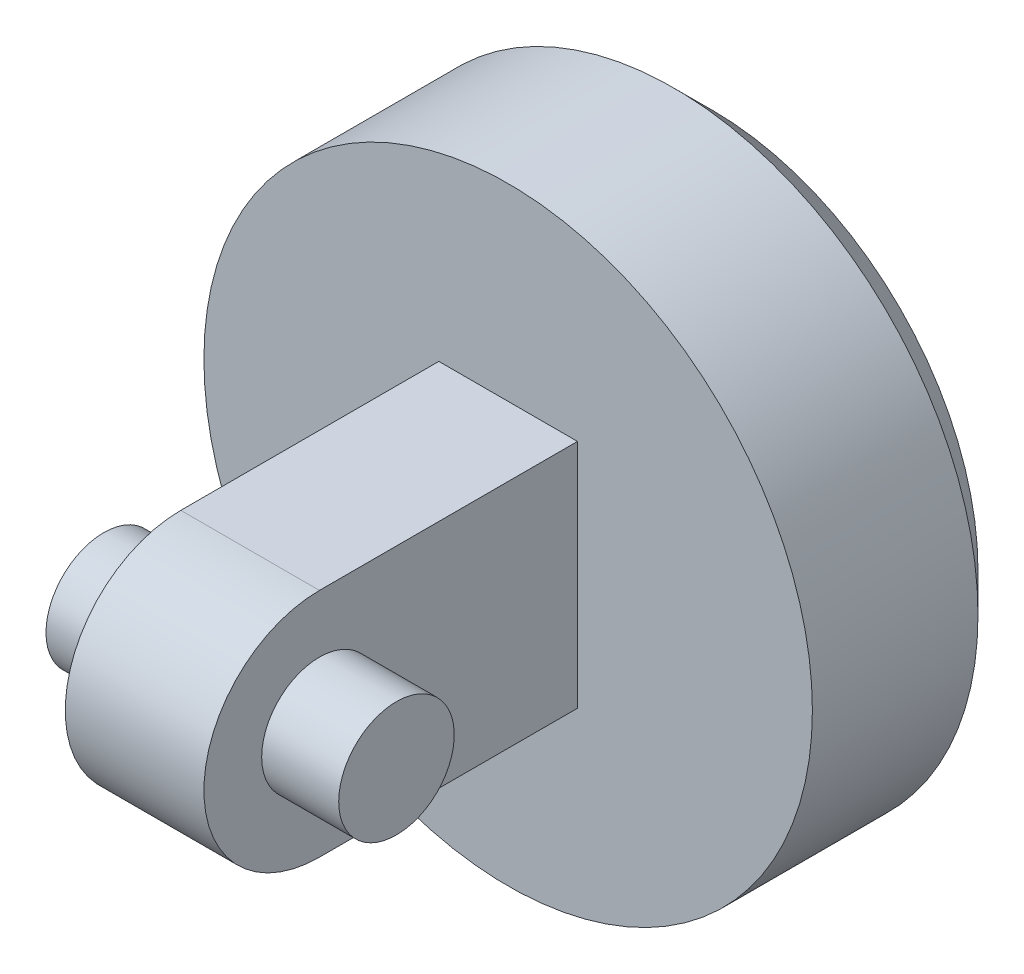
ISO-10303-21;
HEADER;
FILE_DESCRIPTION(('STEP AP214'),'2;1');
FILE_NAME('part.step','',(''),(''),'','','');
FILE_SCHEMA(('AUTOMOTIVE_DESIGN { 1 0 10303 214 1 1 1 1 }'));
ENDSEC;
DATA;
#1=APPLICATION_CONTEXT('core data for automotive mechanical design processes');
#2=APPLICATION_PROTOCOL_DEFINITION('international standard','automotive_design',2000,#1);
#3=PRODUCT_CONTEXT('',#1,'mechanical');
#4=PRODUCT('Part','Part','',(#3));
#5=PRODUCT_RELATED_PRODUCT_CATEGORY('part','',(#4));
#6=PRODUCT_DEFINITION_FORMATION('','',#4);
#7=PRODUCT_DEFINITION_CONTEXT('part definition',#1,'design');
#8=PRODUCT_DEFINITION('design','',#6,#7);
#9=PRODUCT_DEFINITION_SHAPE('','',#8);
#10=(LENGTH_UNIT() NAMED_UNIT(*) SI_UNIT(.MILLI.,.METRE.));
#11=(NAMED_UNIT(*) PLANE_ANGLE_UNIT() SI_UNIT($,.RADIAN.));
#12=(NAMED_UNIT(*) SI_UNIT($,.STERADIAN.) SOLID_ANGLE_UNIT());
#13=UNCERTAINTY_MEASURE_WITH_UNIT(LENGTH_MEASURE(1.E-05),#10,'distance_accuracy_value','');
#14=(GEOMETRIC_REPRESENTATION_CONTEXT(3) GLOBAL_UNCERTAINTY_ASSIGNED_CONTEXT((#13)) GLOBAL_UNIT_ASSIGNED_CONTEXT((#10,
#11,#12)) REPRESENTATION_CONTEXT('',''));
#15=CARTESIAN_POINT('',(0.,0.,0.));
#16=DIRECTION('',(0.,0.,1.));
#17=DIRECTION('',(1.,0.,0.));
#18=AXIS2_PLACEMENT_3D('',#15,#16,#17);
#19=CARTESIAN_POINT('',(-1.8,-3.,15.));
#20=DIRECTION('',(1.,0.,0.));
#21=DIRECTION('',(0.,0.,-1.));
#22=AXIS2_PLACEMENT_3D('',#19,#20,#21);
#23=PLANE('',#22);
#24=DIRECTION('',(0.,0.,-1.));
#25=VECTOR('',#24,1.);
#26=CARTESIAN_POINT('',(-1.8,-3.,15.));
#27=LINE('',#26,#25);
#28=CARTESIAN_POINT('',(-1.8,-3.,12.));
#29=VERTEX_POINT('',#28);
#30=CARTESIAN_POINT('',(-1.8,-3.,5.3));
#31=VERTEX_POINT('',#30);
#32=EDGE_CURVE('E53',#29,#31,#27,.T.);
#33=ORIENTED_EDGE('',*,*,#32,.F.);
#34=CARTESIAN_POINT('',(-1.8,0.,12.));
#35=DIRECTION('',(1.,0.,0.));
#36=DIRECTION('',(0.,0.,-1.));
#37=AXIS2_PLACEMENT_3D('',#34,#35,#36);
#38=CIRCLE('',#37,3.);
#39=CARTESIAN_POINT('',(-1.8,3.,12.));
#40=VERTEX_POINT('',#39);
#41=EDGE_CURVE('E46',#29,#40,#38,.F.);
#42=ORIENTED_EDGE('',*,*,#41,.T.);
#43=DIRECTION('',(0.,0.,-1.));
#44=VECTOR('',#43,1.);
#45=CARTESIAN_POINT('',(-1.8,3.,15.));
#46=LINE('',#45,#44);
#47=CARTESIAN_POINT('',(-1.8,3.,5.3));
#48=VERTEX_POINT('',#47);
#49=EDGE_CURVE('E74',#40,#48,#46,.T.);
#50=ORIENTED_EDGE('',*,*,#49,.T.);
#51=DIRECTION('',(0.,-1.,0.));
#52=VECTOR('',#51,1.);
#53=CARTESIAN_POINT('',(-1.8,-3.,5.3));
#54=LINE('',#53,#52);
#55=EDGE_CURVE('E124',#48,#31,#54,.T.);
#56=ORIENTED_EDGE('',*,*,#55,.T.);
#57=EDGE_LOOP('',(#33,#42,#50,#56));
#58=FACE_BOUND('',#57,.T.);
#59=CARTESIAN_POINT('',(-1.8,0.,12.));
#60=DIRECTION('',(1.,0.,0.));
#61=DIRECTION('',(0.,0.,-1.));
#62=AXIS2_PLACEMENT_3D('',#59,#60,#61);
#63=CIRCLE('',#62,1.5);
#64=CARTESIAN_POINT('',(-1.8,0.,10.5));
#65=VERTEX_POINT('',#64);
#66=EDGE_CURVE('E11',#65,#65,#63,.F.);
#67=ORIENTED_EDGE('',*,*,#66,.F.);
#68=EDGE_LOOP('',(#67));
#69=FACE_BOUND('',#68,.T.);
#70=ADVANCED_FACE('F31',(#58,#69),#23,.F.);
#71=CARTESIAN_POINT('',(-1.8,3.,15.));
#72=DIRECTION('',(0.,-1.,0.));
#73=DIRECTION('',(0.,0.,-1.));
#74=AXIS2_PLACEMENT_3D('',#71,#72,#73);
#75=PLANE('',#74);
#76=DIRECTION('',(1.,0.,0.));
#77=VECTOR('',#76,1.);
#78=CARTESIAN_POINT('',(-47.5655633127628,3.,12.));
#79=LINE('',#78,#77);
#80=CARTESIAN_POINT('',(1.8,3.,12.));
#81=VERTEX_POINT('',#80);
#82=EDGE_CURVE('E80',#40,#81,#79,.T.);
#83=ORIENTED_EDGE('',*,*,#82,.T.);
#84=DIRECTION('',(0.,0.,-1.));
#85=VECTOR('',#84,1.);
#86=CARTESIAN_POINT('',(1.8,3.,15.));
#87=LINE('',#86,#85);
#88=CARTESIAN_POINT('',(1.8,3.,5.3));
#89=VERTEX_POINT('',#88);
#90=EDGE_CURVE('E90',#81,#89,#87,.T.);
#91=ORIENTED_EDGE('',*,*,#90,.T.);
#92=DIRECTION('',(-1.,0.,0.));
#93=VECTOR('',#92,1.);
#94=CARTESIAN_POINT('',(-1.8,3.,5.3));
#95=LINE('',#94,#93);
#96=EDGE_CURVE('E88',#89,#48,#95,.T.);
#97=ORIENTED_EDGE('',*,*,#96,.T.);
#98=ORIENTED_EDGE('',*,*,#49,.F.);
#99=EDGE_LOOP('',(#83,#91,#97,#98));
#100=FACE_BOUND('',#99,.T.);
#101=ADVANCED_FACE('F86',(#100),#75,.F.);
#102=CARTESIAN_POINT('',(0.,0.,5.3));
#103=DIRECTION('',(0.,0.,1.));
#104=DIRECTION('',(1.,0.,0.));
#105=AXIS2_PLACEMENT_3D('',#102,#103,#104);
#106=PLANE('',#105);
#107=CARTESIAN_POINT('',(0.,0.,5.3));
#108=DIRECTION('',(0.,0.,1.));
#109=DIRECTION('',(1.,0.,0.));
#110=AXIS2_PLACEMENT_3D('',#107,#108,#109);
#111=CIRCLE('',#110,7.9);
#112=CARTESIAN_POINT('',(7.9,0.,5.3));
#113=VERTEX_POINT('',#112);
#114=EDGE_CURVE('E92',#113,#113,#111,.T.);
#115=ORIENTED_EDGE('',*,*,#114,.T.);
#116=EDGE_LOOP('',(#115));
#117=FACE_BOUND('',#116,.T.);
#118=ORIENTED_EDGE('',*,*,#96,.F.);
#119=DIRECTION('',(0.,1.,0.));
#120=VECTOR('',#119,1.);
#121=CARTESIAN_POINT('',(1.8,-3.,5.3));
#122=LINE('',#121,#120);
#123=CARTESIAN_POINT('',(1.8,-3.,5.3));
#124=VERTEX_POINT('',#123);
#125=EDGE_CURVE('E76',#124,#89,#122,.T.);
#126=ORIENTED_EDGE('',*,*,#125,.F.);
#127=DIRECTION('',(1.,0.,0.));
#128=VECTOR('',#127,1.);
#129=CARTESIAN_POINT('',(-1.8,-3.,5.3));
#130=LINE('',#129,#128);
#131=EDGE_CURVE('E126',#31,#124,#130,.T.);
#132=ORIENTED_EDGE('',*,*,#131,.F.);
#133=ORIENTED_EDGE('',*,*,#55,.F.);
#134=EDGE_LOOP('',(#118,#126,#132,#133));
#135=FACE_BOUND('',#134,.T.);
#136=ADVANCED_FACE('F115',(#117,#135),#106,.T.);
#137=CARTESIAN_POINT('',(0.,0.,5.3));
#138=DIRECTION('',(0.,0.,-1.));
#139=DIRECTION('',(-1.,0.,0.));
#140=AXIS2_PLACEMENT_3D('',#137,#138,#139);
#141=CYLINDRICAL_SURFACE('',#140,7.9);
#142=CARTESIAN_POINT('',(0.,0.,1.));
#143=DIRECTION('',(0.,0.,1.));
#144=DIRECTION('',(1.,0.,0.));
#145=AXIS2_PLACEMENT_3D('',#142,#143,#144);
#146=CIRCLE('',#145,7.9);
#147=CARTESIAN_POINT('',(7.9,0.,1.));
#148=VERTEX_POINT('',#147);
#149=EDGE_CURVE('E100',#148,#148,#146,.T.);
#150=ORIENTED_EDGE('',*,*,#149,.T.);
#151=EDGE_LOOP('',(#150));
#152=FACE_BOUND('',#151,.T.);
#153=ORIENTED_EDGE('',*,*,#114,.F.);
#154=EDGE_LOOP('',(#153));
#155=FACE_BOUND('',#154,.T.);
#156=ADVANCED_FACE('F112',(#152,#155),#141,.T.);
#157=CARTESIAN_POINT('',(0.,0.,0.));
#158=DIRECTION('',(0.,0.,1.));
#159=DIRECTION('',(1.,0.,0.));
#160=AXIS2_PLACEMENT_3D('',#157,#158,#159);
#161=PLANE('',#160);
#162=CARTESIAN_POINT('',(0.,0.,0.));
#163=DIRECTION('',(0.,0.,1.));
#164=DIRECTION('',(1.,0.,0.));
#165=AXIS2_PLACEMENT_3D('',#162,#163,#164);
#166=CIRCLE('',#165,6.9);
#167=CARTESIAN_POINT('',(6.9,0.,0.));
#168=VERTEX_POINT('',#167);
#169=EDGE_CURVE('E39',#168,#168,#166,.F.);
#170=ORIENTED_EDGE('',*,*,#169,.T.);
#171=EDGE_LOOP('',(#170));
#172=FACE_BOUND('',#171,.T.);
#173=ADVANCED_FACE('F105',(#172),#161,.F.);
#174=CARTESIAN_POINT('',(1.8,-3.,15.));
#175=DIRECTION('',(-1.,0.,0.));
#176=DIRECTION('',(0.,0.,1.));
#177=AXIS2_PLACEMENT_3D('',#174,#175,#176);
#178=PLANE('',#177);
#179=CARTESIAN_POINT('',(1.8,0.,12.));
#180=DIRECTION('',(-1.,0.,0.));
#181=DIRECTION('',(0.,0.,1.));
#182=AXIS2_PLACEMENT_3D('',#179,#180,#181);
#183=CIRCLE('',#182,1.5);
#184=CARTESIAN_POINT('',(1.8,0.,13.5));
#185=VERTEX_POINT('',#184);
#186=EDGE_CURVE('E209',#185,#185,#183,.T.);
#187=ORIENTED_EDGE('',*,*,#186,.T.);
#188=EDGE_LOOP('',(#187));
#189=FACE_BOUND('',#188,.T.);
#190=CARTESIAN_POINT('',(1.8,0.,12.));
#191=DIRECTION('',(-1.,0.,0.));
#192=DIRECTION('',(0.,0.,1.));
#193=AXIS2_PLACEMENT_3D('',#190,#191,#192);
#194=CIRCLE('',#193,3.);
#195=CARTESIAN_POINT('',(1.8,-3.,12.));
#196=VERTEX_POINT('',#195);
#197=EDGE_CURVE('E77',#81,#196,#194,.F.);
#198=ORIENTED_EDGE('',*,*,#197,.T.);
#199=DIRECTION('',(0.,0.,-1.));
#200=VECTOR('',#199,1.);
#201=CARTESIAN_POINT('',(1.8,-3.,15.));
#202=LINE('',#201,#200);
#203=EDGE_CURVE('E94',#196,#124,#202,.T.);
#204=ORIENTED_EDGE('',*,*,#203,.T.);
#205=ORIENTED_EDGE('',*,*,#125,.T.);
#206=ORIENTED_EDGE('',*,*,#90,.F.);
#207=EDGE_LOOP('',(#198,#204,#205,#206));
#208=FACE_BOUND('',#207,.T.);
#209=ADVANCED_FACE('F133',(#189,#208),#178,.F.);
#210=CARTESIAN_POINT('',(-1.8,-3.,15.));
#211=DIRECTION('',(0.,1.,0.));
#212=DIRECTION('',(0.,0.,1.));
#213=AXIS2_PLACEMENT_3D('',#210,#211,#212);
#214=PLANE('',#213);
#215=ORIENTED_EDGE('',*,*,#203,.F.);
#216=DIRECTION('',(1.,0.,0.));
#217=VECTOR('',#216,1.);
#218=CARTESIAN_POINT('',(-47.5655633127628,-3.,12.));
#219=LINE('',#218,#217);
#220=EDGE_CURVE('E84',#29,#196,#219,.T.);
#221=ORIENTED_EDGE('',*,*,#220,.F.);
#222=ORIENTED_EDGE('',*,*,#32,.T.);
#223=ORIENTED_EDGE('',*,*,#131,.T.);
#224=EDGE_LOOP('',(#215,#221,#222,#223));
#225=FACE_BOUND('',#224,.T.);
#226=ADVANCED_FACE('F134',(#225),#214,.F.);
#227=CARTESIAN_POINT('',(-47.5655633127628,0.,12.));
#228=DIRECTION('',(1.,0.,0.));
#229=DIRECTION('',(0.,0.,-1.));
#230=AXIS2_PLACEMENT_3D('',#227,#228,#229);
#231=CYLINDRICAL_SURFACE('',#230,3.);
#232=ORIENTED_EDGE('',*,*,#220,.T.);
#233=ORIENTED_EDGE('',*,*,#197,.F.);
#234=ORIENTED_EDGE('',*,*,#82,.F.);
#235=ORIENTED_EDGE('',*,*,#41,.F.);
#236=EDGE_LOOP('',(#232,#233,#234,#235));
#237=FACE_BOUND('',#236,.T.);
#238=ADVANCED_FACE('F81',(#237),#231,.T.);
#239=CARTESIAN_POINT('',(0.,0.,1.));
#240=DIRECTION('',(0.,0.,1.));
#241=DIRECTION('',(1.,0.,0.));
#242=AXIS2_PLACEMENT_3D('',#239,#240,#241);
#243=CONICAL_SURFACE('',#242,7.9,0.78539816339745);
#244=ORIENTED_EDGE('',*,*,#169,.F.);
#245=EDGE_LOOP('',(#244));
#246=FACE_BOUND('',#245,.T.);
#247=ORIENTED_EDGE('',*,*,#149,.F.);
#248=EDGE_LOOP('',(#247));
#249=FACE_BOUND('',#248,.T.);
#250=ADVANCED_FACE('F33',(#246,#249),#243,.T.);
#251=CARTESIAN_POINT('',(-3.8,0.,12.));
#252=DIRECTION('',(1.,0.,0.));
#253=DIRECTION('',(0.,0.,-1.));
#254=AXIS2_PLACEMENT_3D('',#251,#252,#253);
#255=CYLINDRICAL_SURFACE('',#254,1.5);
#256=CARTESIAN_POINT('',(-3.8,0.,12.));
#257=DIRECTION('',(-1.,0.,0.));
#258=DIRECTION('',(0.,0.,1.));
#259=AXIS2_PLACEMENT_3D('',#256,#257,#258);
#260=CIRCLE('',#259,1.5);
#261=CARTESIAN_POINT('',(-3.8,0.,13.5));
#262=VERTEX_POINT('',#261);
#263=EDGE_CURVE('E203',#262,#262,#260,.T.);
#264=ORIENTED_EDGE('',*,*,#263,.F.);
#265=EDGE_LOOP('',(#264));
#266=FACE_BOUND('',#265,.T.);
#267=ORIENTED_EDGE('',*,*,#66,.T.);
#268=EDGE_LOOP('',(#267));
#269=FACE_BOUND('',#268,.T.);
#270=ADVANCED_FACE('F109',(#266,#269),#255,.T.);
#271=CARTESIAN_POINT('',(-3.8,0.,12.));
#272=DIRECTION('',(-1.,0.,0.));
#273=DIRECTION('',(0.,0.,1.));
#274=AXIS2_PLACEMENT_3D('',#271,#272,#273);
#275=PLANE('',#274);
#276=ORIENTED_EDGE('',*,*,#263,.T.);
#277=EDGE_LOOP('',(#276));
#278=FACE_BOUND('',#277,.T.);
#279=ADVANCED_FACE('F169',(#278),#275,.T.);
#280=CARTESIAN_POINT('',(3.8,0.,12.));
#281=DIRECTION('',(-1.,0.,0.));
#282=DIRECTION('',(0.,0.,1.));
#283=AXIS2_PLACEMENT_3D('',#280,#281,#282);
#284=CYLINDRICAL_SURFACE('',#283,1.5);
#285=CARTESIAN_POINT('',(3.8,0.,12.));
#286=DIRECTION('',(-1.,0.,0.));
#287=DIRECTION('',(0.,0.,1.));
#288=AXIS2_PLACEMENT_3D('',#285,#286,#287);
#289=CIRCLE('',#288,1.5);
#290=CARTESIAN_POINT('',(3.8,0.,13.5));
#291=VERTEX_POINT('',#290);
#292=EDGE_CURVE('E205',#291,#291,#289,.T.);
#293=ORIENTED_EDGE('',*,*,#292,.T.);
#294=EDGE_LOOP('',(#293));
#295=FACE_BOUND('',#294,.T.);
#296=ORIENTED_EDGE('',*,*,#186,.F.);
#297=EDGE_LOOP('',(#296));
#298=FACE_BOUND('',#297,.T.);
#299=ADVANCED_FACE('F174',(#295,#298),#284,.T.);
#300=CARTESIAN_POINT('',(3.8,0.,12.));
#301=DIRECTION('',(1.,0.,0.));
#302=DIRECTION('',(0.,0.,1.));
#303=AXIS2_PLACEMENT_3D('',#300,#301,#302);
#304=PLANE('',#303);
#305=ORIENTED_EDGE('',*,*,#292,.F.);
#306=EDGE_LOOP('',(#305));
#307=FACE_BOUND('',#306,.T.);
#308=ADVANCED_FACE('F179',(#307),#304,.T.);
#309=CLOSED_SHELL('',(#70,#101,#136,#156,#173,#209,#226,#238,#250,#270,#279,#299,#308));
#310=MANIFOLD_SOLID_BREP('B2',#309);
#311=ADVANCED_BREP_SHAPE_REPRESENTATION('',(#18,#310),#14);
#312=SHAPE_DEFINITION_REPRESENTATION(#9,#311);
ENDSEC;
END-ISO-10303-21;
